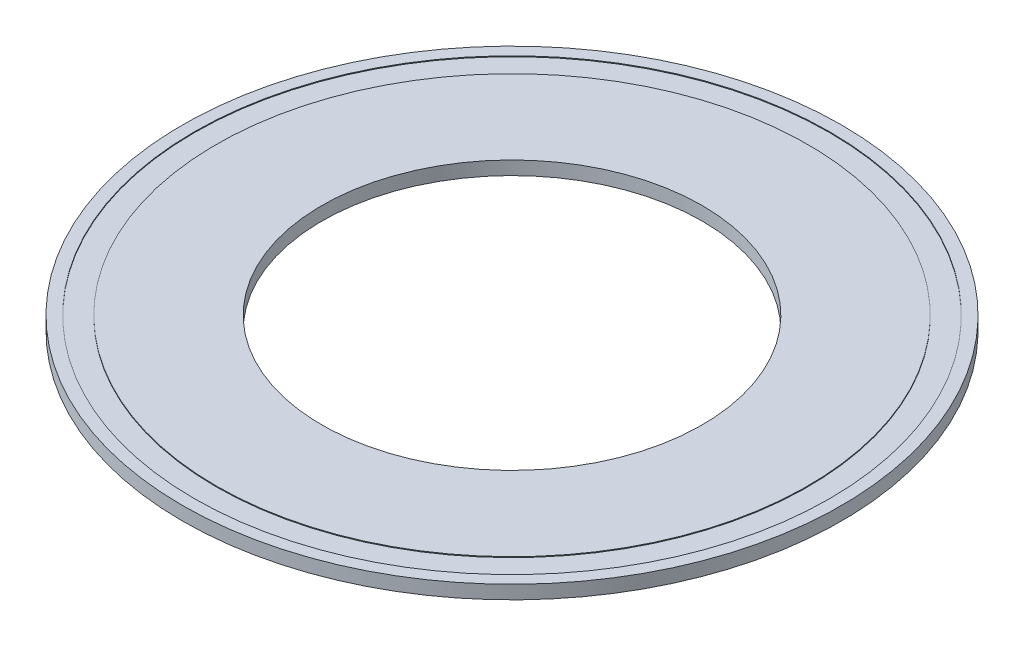
ISO-10303-21;
HEADER;
FILE_DESCRIPTION(('STEP AP214'),'2;1');
FILE_NAME('part.step','',(''),(''),'','','');
FILE_SCHEMA(('AUTOMOTIVE_DESIGN { 1 0 10303 214 1 1 1 1 }'));
ENDSEC;
DATA;
#1=APPLICATION_CONTEXT('core data for automotive mechanical design processes');
#2=APPLICATION_PROTOCOL_DEFINITION('international standard','automotive_design',2000,#1);
#3=PRODUCT_CONTEXT('',#1,'mechanical');
#4=PRODUCT('Part','Part','',(#3));
#5=PRODUCT_RELATED_PRODUCT_CATEGORY('part','',(#4));
#6=PRODUCT_DEFINITION_FORMATION('','',#4);
#7=PRODUCT_DEFINITION_CONTEXT('part definition',#1,'design');
#8=PRODUCT_DEFINITION('design','',#6,#7);
#9=PRODUCT_DEFINITION_SHAPE('','',#8);
#10=(LENGTH_UNIT() NAMED_UNIT(*) SI_UNIT(.MILLI.,.METRE.));
#11=(NAMED_UNIT(*) PLANE_ANGLE_UNIT() SI_UNIT($,.RADIAN.));
#12=(NAMED_UNIT(*) SI_UNIT($,.STERADIAN.) SOLID_ANGLE_UNIT());
#13=UNCERTAINTY_MEASURE_WITH_UNIT(LENGTH_MEASURE(1.E-05),#10,'distance_accuracy_value','');
#14=(GEOMETRIC_REPRESENTATION_CONTEXT(3) GLOBAL_UNCERTAINTY_ASSIGNED_CONTEXT((#13)) GLOBAL_UNIT_ASSIGNED_CONTEXT((#10,
#11,#12)) REPRESENTATION_CONTEXT('',''));
#15=CARTESIAN_POINT('',(0.,0.,0.));
#16=DIRECTION('',(0.,0.,1.));
#17=DIRECTION('',(1.,0.,0.));
#18=AXIS2_PLACEMENT_3D('',#15,#16,#17);
#19=CARTESIAN_POINT('',(39.,0.8,0.));
#20=DIRECTION('',(0.,1.,0.));
#21=DIRECTION('',(0.,0.,1.));
#22=AXIS2_PLACEMENT_3D('',#19,#20,#21);
#23=PLANE('',#22);
#24=CARTESIAN_POINT('',(0.,0.799999999999999,0.));
#25=DIRECTION('',(0.,-1.,0.));
#26=DIRECTION('',(0.,0.,-1.));
#27=AXIS2_PLACEMENT_3D('',#24,#25,#26);
#28=CIRCLE('',#27,22.5);
#29=CARTESIAN_POINT('',(0.,0.799999999999999,-22.5));
#30=VERTEX_POINT('',#29);
#31=EDGE_CURVE('E36',#30,#30,#28,.T.);
#32=ORIENTED_EDGE('',*,*,#31,.T.);
#33=EDGE_LOOP('',(#32));
#34=FACE_BOUND('',#33,.T.);
#35=CARTESIAN_POINT('',(0.,0.8,0.));
#36=DIRECTION('',(0.,1.,0.));
#37=DIRECTION('',(0.,0.,1.));
#38=AXIS2_PLACEMENT_3D('',#35,#36,#37);
#39=CIRCLE('',#38,35.);
#40=CARTESIAN_POINT('',(0.,0.8,35.));
#41=VERTEX_POINT('',#40);
#42=EDGE_CURVE('E56',#41,#41,#39,.T.);
#43=ORIENTED_EDGE('',*,*,#42,.T.);
#44=EDGE_LOOP('',(#43));
#45=FACE_BOUND('',#44,.T.);
#46=ADVANCED_FACE('F29',(#34,#45),#23,.T.);
#47=CARTESIAN_POINT('',(0.,-15.2986465186809,0.));
#48=DIRECTION('',(0.,-1.,0.));
#49=DIRECTION('',(0.,0.,-1.));
#50=AXIS2_PLACEMENT_3D('',#47,#48,#49);
#51=CYLINDRICAL_SURFACE('',#50,39.);
#52=CARTESIAN_POINT('',(0.,0.800000000000002,0.));
#53=DIRECTION('',(0.,-1.,0.));
#54=DIRECTION('',(0.,0.,-1.));
#55=AXIS2_PLACEMENT_3D('',#52,#53,#54);
#56=CIRCLE('',#55,39.);
#57=CARTESIAN_POINT('',(0.,0.800000000000002,-39.));
#58=VERTEX_POINT('',#57);
#59=EDGE_CURVE('E10',#58,#58,#56,.T.);
#60=ORIENTED_EDGE('',*,*,#59,.T.);
#61=EDGE_LOOP('',(#60));
#62=FACE_BOUND('',#61,.T.);
#63=CARTESIAN_POINT('',(0.,-0.8,0.));
#64=DIRECTION('',(0.,-1.,0.));
#65=DIRECTION('',(0.,0.,-1.));
#66=AXIS2_PLACEMENT_3D('',#63,#64,#65);
#67=CIRCLE('',#66,39.);
#68=CARTESIAN_POINT('',(0.,-0.8,-39.));
#69=VERTEX_POINT('',#68);
#70=EDGE_CURVE('E44',#69,#69,#67,.T.);
#71=ORIENTED_EDGE('',*,*,#70,.F.);
#72=EDGE_LOOP('',(#71));
#73=FACE_BOUND('',#72,.T.);
#74=ADVANCED_FACE('F31',(#62,#73),#51,.T.);
#75=CARTESIAN_POINT('',(0.,0.8,0.));
#76=DIRECTION('',(0.,1.,0.));
#77=DIRECTION('',(0.,0.,1.));
#78=AXIS2_PLACEMENT_3D('',#75,#76,#77);
#79=CIRCLE('',#78,37.6);
#80=CARTESIAN_POINT('',(0.,0.8,37.6));
#81=VERTEX_POINT('',#80);
#82=EDGE_CURVE('E50',#81,#81,#79,.T.);
#83=ORIENTED_EDGE('',*,*,#82,.F.);
#84=EDGE_LOOP('',(#83));
#85=FACE_BOUND('',#84,.T.);
#86=ORIENTED_EDGE('',*,*,#59,.F.);
#87=EDGE_LOOP('',(#86));
#88=FACE_BOUND('',#87,.T.);
#89=ADVANCED_FACE('F78',(#85,#88),#23,.T.);
#90=CARTESIAN_POINT('',(0.,-15.2986465186809,0.));
#91=DIRECTION('',(0.,-1.,0.));
#92=DIRECTION('',(0.,0.,-1.));
#93=AXIS2_PLACEMENT_3D('',#90,#91,#92);
#94=CYLINDRICAL_SURFACE('',#93,22.5);
#95=CARTESIAN_POINT('',(0.,-0.8,0.));
#96=DIRECTION('',(0.,-1.,0.));
#97=DIRECTION('',(0.,0.,-1.));
#98=AXIS2_PLACEMENT_3D('',#95,#96,#97);
#99=CIRCLE('',#98,22.5);
#100=CARTESIAN_POINT('',(0.,-0.8,-22.5));
#101=VERTEX_POINT('',#100);
#102=EDGE_CURVE('E40',#101,#101,#99,.T.);
#103=ORIENTED_EDGE('',*,*,#102,.T.);
#104=EDGE_LOOP('',(#103));
#105=FACE_BOUND('',#104,.T.);
#106=ORIENTED_EDGE('',*,*,#31,.F.);
#107=EDGE_LOOP('',(#106));
#108=FACE_BOUND('',#107,.T.);
#109=ADVANCED_FACE('F81',(#105,#108),#94,.F.);
#110=CARTESIAN_POINT('',(22.5,-0.8,0.));
#111=DIRECTION('',(0.,-1.,0.));
#112=DIRECTION('',(0.,0.,-1.));
#113=AXIS2_PLACEMENT_3D('',#110,#111,#112);
#114=PLANE('',#113);
#115=ORIENTED_EDGE('',*,*,#70,.T.);
#116=EDGE_LOOP('',(#115));
#117=FACE_BOUND('',#116,.T.);
#118=ORIENTED_EDGE('',*,*,#102,.F.);
#119=EDGE_LOOP('',(#118));
#120=FACE_BOUND('',#119,.T.);
#121=ADVANCED_FACE('F74',(#117,#120),#114,.T.);
#122=CARTESIAN_POINT('',(0.,0.7,0.));
#123=DIRECTION('',(0.,1.,0.));
#124=DIRECTION('',(0.,0.,1.));
#125=AXIS2_PLACEMENT_3D('',#122,#123,#124);
#126=CYLINDRICAL_SURFACE('',#125,37.6);
#127=CARTESIAN_POINT('',(0.,0.7,0.));
#128=DIRECTION('',(0.,1.,0.));
#129=DIRECTION('',(0.,0.,1.));
#130=AXIS2_PLACEMENT_3D('',#127,#128,#129);
#131=CIRCLE('',#130,37.6);
#132=CARTESIAN_POINT('',(0.,0.7,37.6));
#133=VERTEX_POINT('',#132);
#134=EDGE_CURVE('E49',#133,#133,#131,.T.);
#135=ORIENTED_EDGE('',*,*,#134,.F.);
#136=EDGE_LOOP('',(#135));
#137=FACE_BOUND('',#136,.T.);
#138=ORIENTED_EDGE('',*,*,#82,.T.);
#139=EDGE_LOOP('',(#138));
#140=FACE_BOUND('',#139,.T.);
#141=ADVANCED_FACE('F68',(#137,#140),#126,.F.);
#142=CARTESIAN_POINT('',(0.,0.7,0.));
#143=DIRECTION('',(0.,1.,0.));
#144=DIRECTION('',(0.,0.,1.));
#145=AXIS2_PLACEMENT_3D('',#142,#143,#144);
#146=PLANE('',#145);
#147=CARTESIAN_POINT('',(0.,0.7,0.));
#148=DIRECTION('',(0.,1.,0.));
#149=DIRECTION('',(0.,0.,1.));
#150=AXIS2_PLACEMENT_3D('',#147,#148,#149);
#151=CIRCLE('',#150,35.);
#152=CARTESIAN_POINT('',(0.,0.7,35.));
#153=VERTEX_POINT('',#152);
#154=EDGE_CURVE('E53',#153,#153,#151,.T.);
#155=ORIENTED_EDGE('',*,*,#154,.F.);
#156=EDGE_LOOP('',(#155));
#157=FACE_BOUND('',#156,.T.);
#158=ORIENTED_EDGE('',*,*,#134,.T.);
#159=EDGE_LOOP('',(#158));
#160=FACE_BOUND('',#159,.T.);
#161=ADVANCED_FACE('F65',(#157,#160),#146,.T.);
#162=CARTESIAN_POINT('',(0.,0.7,0.));
#163=DIRECTION('',(0.,1.,0.));
#164=DIRECTION('',(0.,0.,1.));
#165=AXIS2_PLACEMENT_3D('',#162,#163,#164);
#166=CYLINDRICAL_SURFACE('',#165,35.);
#167=ORIENTED_EDGE('',*,*,#154,.T.);
#168=EDGE_LOOP('',(#167));
#169=FACE_BOUND('',#168,.T.);
#170=ORIENTED_EDGE('',*,*,#42,.F.);
#171=EDGE_LOOP('',(#170));
#172=FACE_BOUND('',#171,.T.);
#173=ADVANCED_FACE('F62',(#169,#172),#166,.T.);
#174=CLOSED_SHELL('',(#46,#74,#89,#109,#121,#141,#161,#173));
#175=MANIFOLD_SOLID_BREP('B2',#174);
#176=ADVANCED_BREP_SHAPE_REPRESENTATION('',(#18,#175),#14);
#177=SHAPE_DEFINITION_REPRESENTATION(#9,#176);
ENDSEC;
END-ISO-10303-21;
